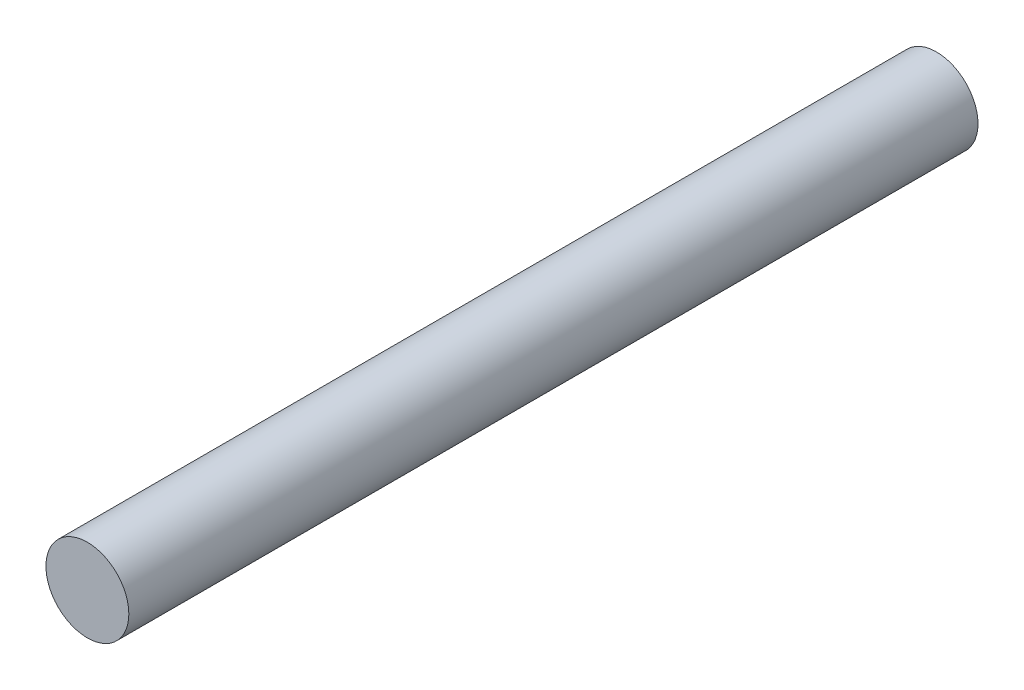
ISO-10303-21;
HEADER;
FILE_DESCRIPTION(('STEP AP214'),'2;1');
FILE_NAME('part.step','',(''),(''),'','','');
FILE_SCHEMA(('AUTOMOTIVE_DESIGN { 1 0 10303 214 1 1 1 1 }'));
ENDSEC;
DATA;
#1=APPLICATION_CONTEXT('core data for automotive mechanical design processes');
#2=APPLICATION_PROTOCOL_DEFINITION('international standard','automotive_design',2000,#1);
#3=PRODUCT_CONTEXT('',#1,'mechanical');
#4=PRODUCT('Part','Part','',(#3));
#5=PRODUCT_RELATED_PRODUCT_CATEGORY('part','',(#4));
#6=PRODUCT_DEFINITION_FORMATION('','',#4);
#7=PRODUCT_DEFINITION_CONTEXT('part definition',#1,'design');
#8=PRODUCT_DEFINITION('design','',#6,#7);
#9=PRODUCT_DEFINITION_SHAPE('','',#8);
#10=(LENGTH_UNIT() NAMED_UNIT(*) SI_UNIT(.MILLI.,.METRE.));
#11=(NAMED_UNIT(*) PLANE_ANGLE_UNIT() SI_UNIT($,.RADIAN.));
#12=(NAMED_UNIT(*) SI_UNIT($,.STERADIAN.) SOLID_ANGLE_UNIT());
#13=UNCERTAINTY_MEASURE_WITH_UNIT(LENGTH_MEASURE(1.E-05),#10,'distance_accuracy_value','');
#14=(GEOMETRIC_REPRESENTATION_CONTEXT(3) GLOBAL_UNCERTAINTY_ASSIGNED_CONTEXT((#13)) GLOBAL_UNIT_ASSIGNED_CONTEXT((#10,
#11,#12)) REPRESENTATION_CONTEXT('',''));
#15=CARTESIAN_POINT('',(0.,0.,0.));
#16=DIRECTION('',(0.,0.,1.));
#17=DIRECTION('',(1.,0.,0.));
#18=AXIS2_PLACEMENT_3D('',#15,#16,#17);
#19=CARTESIAN_POINT('',(0.,0.,-33.));
#20=DIRECTION('',(0.,0.,1.));
#21=DIRECTION('',(1.,0.,0.));
#22=AXIS2_PLACEMENT_3D('',#19,#20,#21);
#23=CYLINDRICAL_SURFACE('',#22,4.54);
#24=CARTESIAN_POINT('',(0.,0.,-33.));
#25=DIRECTION('',(0.,0.,1.));
#26=DIRECTION('',(1.,0.,0.));
#27=AXIS2_PLACEMENT_3D('',#24,#25,#26);
#28=CIRCLE('',#27,4.54);
#29=CARTESIAN_POINT('',(4.54,0.,-33.));
#30=VERTEX_POINT('',#29);
#31=EDGE_CURVE('E10',#30,#30,#28,.T.);
#32=ORIENTED_EDGE('',*,*,#31,.T.);
#33=EDGE_LOOP('',(#32));
#34=FACE_BOUND('',#33,.T.);
#35=CARTESIAN_POINT('',(0.,0.,60.));
#36=DIRECTION('',(0.,0.,1.));
#37=DIRECTION('',(1.,0.,0.));
#38=AXIS2_PLACEMENT_3D('',#35,#36,#37);
#39=CIRCLE('',#38,4.54);
#40=CARTESIAN_POINT('',(4.54,0.,60.));
#41=VERTEX_POINT('',#40);
#42=EDGE_CURVE('E37',#41,#41,#39,.T.);
#43=ORIENTED_EDGE('',*,*,#42,.F.);
#44=EDGE_LOOP('',(#43));
#45=FACE_BOUND('',#44,.T.);
#46=ADVANCED_FACE('F31',(#34,#45),#23,.T.);
#47=CARTESIAN_POINT('',(0.,0.,-33.));
#48=DIRECTION('',(0.,0.,1.));
#49=DIRECTION('',(1.,0.,0.));
#50=AXIS2_PLACEMENT_3D('',#47,#48,#49);
#51=PLANE('',#50);
#52=ORIENTED_EDGE('',*,*,#31,.F.);
#53=EDGE_LOOP('',(#52));
#54=FACE_BOUND('',#53,.T.);
#55=ADVANCED_FACE('F46',(#54),#51,.F.);
#56=CARTESIAN_POINT('',(0.,0.,60.));
#57=DIRECTION('',(0.,0.,1.));
#58=DIRECTION('',(1.,0.,0.));
#59=AXIS2_PLACEMENT_3D('',#56,#57,#58);
#60=PLANE('',#59);
#61=ORIENTED_EDGE('',*,*,#42,.T.);
#62=EDGE_LOOP('',(#61));
#63=FACE_BOUND('',#62,.T.);
#64=ADVANCED_FACE('F43',(#63),#60,.T.);
#65=CLOSED_SHELL('',(#46,#55,#64));
#66=MANIFOLD_SOLID_BREP('B2',#65);
#67=ADVANCED_BREP_SHAPE_REPRESENTATION('',(#18,#66),#14);
#68=SHAPE_DEFINITION_REPRESENTATION(#9,#67);
ENDSEC;
END-ISO-10303-21;
